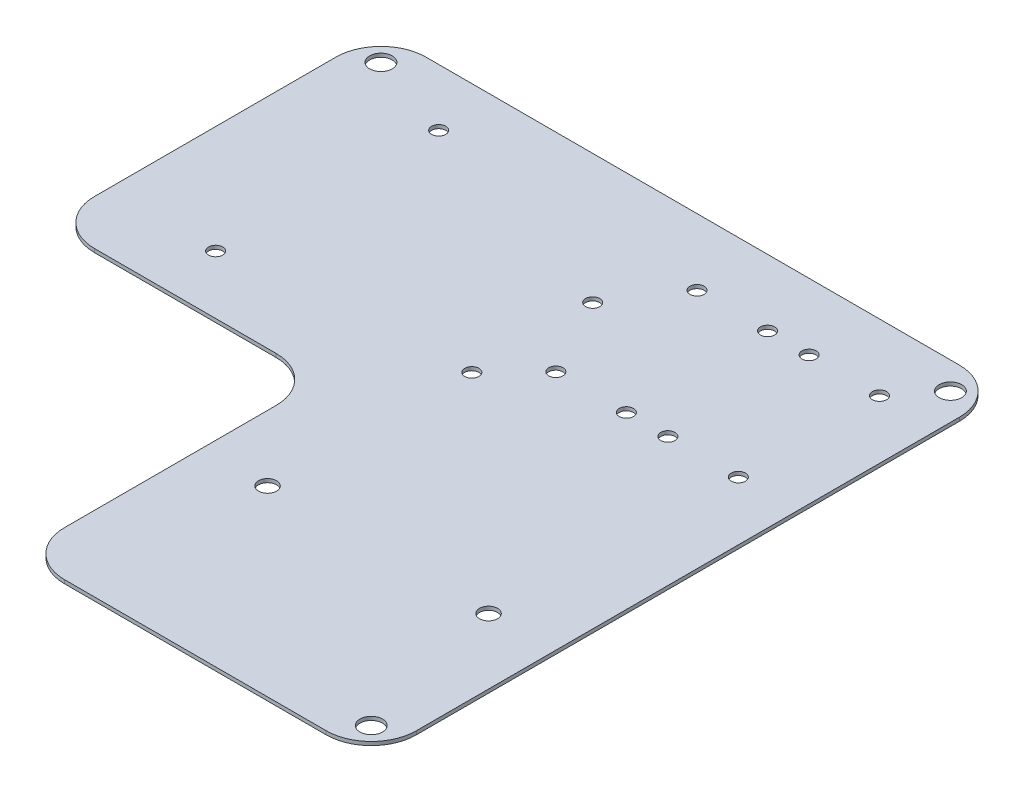
ISO-10303-21;
HEADER;
FILE_DESCRIPTION(('STEP AP214'),'2;1');
FILE_NAME('part.step','',(''),(''),'','','');
FILE_SCHEMA(('AUTOMOTIVE_DESIGN { 1 0 10303 214 1 1 1 1 }'));
ENDSEC;
DATA;
#1=APPLICATION_CONTEXT('core data for automotive mechanical design processes');
#2=APPLICATION_PROTOCOL_DEFINITION('international standard','automotive_design',2000,#1);
#3=PRODUCT_CONTEXT('',#1,'mechanical');
#4=PRODUCT('Part','Part','',(#3));
#5=PRODUCT_RELATED_PRODUCT_CATEGORY('part','',(#4));
#6=PRODUCT_DEFINITION_FORMATION('','',#4);
#7=PRODUCT_DEFINITION_CONTEXT('part definition',#1,'design');
#8=PRODUCT_DEFINITION('design','',#6,#7);
#9=PRODUCT_DEFINITION_SHAPE('','',#8);
#10=(LENGTH_UNIT() NAMED_UNIT(*) SI_UNIT(.MILLI.,.METRE.));
#11=(NAMED_UNIT(*) PLANE_ANGLE_UNIT() SI_UNIT($,.RADIAN.));
#12=(NAMED_UNIT(*) SI_UNIT($,.STERADIAN.) SOLID_ANGLE_UNIT());
#13=UNCERTAINTY_MEASURE_WITH_UNIT(LENGTH_MEASURE(1.E-05),#10,'distance_accuracy_value','');
#14=(GEOMETRIC_REPRESENTATION_CONTEXT(3) GLOBAL_UNCERTAINTY_ASSIGNED_CONTEXT((#13)) GLOBAL_UNIT_ASSIGNED_CONTEXT((#10,
#11,#12)) REPRESENTATION_CONTEXT('',''));
#15=CARTESIAN_POINT('',(0.,0.,0.));
#16=DIRECTION('',(0.,0.,1.));
#17=DIRECTION('',(1.,0.,0.));
#18=AXIS2_PLACEMENT_3D('',#15,#16,#17);
#19=CARTESIAN_POINT('',(66.7401359430946,0.8,39.9912641650939));
#20=DIRECTION('',(0.,1.,0.));
#21=DIRECTION('',(0.,0.,1.));
#22=AXIS2_PLACEMENT_3D('',#19,#20,#21);
#23=PLANE('',#22);
#24=CARTESIAN_POINT('',(70.7401359430946,0.8,-84.4057166015522));
#25=DIRECTION('',(0.,1.,0.));
#26=DIRECTION('',(0.,0.,1.));
#27=AXIS2_PLACEMENT_3D('',#24,#25,#26);
#28=CIRCLE('',#27,2.50000000000001);
#29=CARTESIAN_POINT('',(70.7401359430946,0.8,-81.9057166015522));
#30=VERTEX_POINT('',#29);
#31=EDGE_CURVE('E337',#30,#30,#28,.T.);
#32=ORIENTED_EDGE('',*,*,#31,.F.);
#33=EDGE_LOOP('',(#32));
#34=FACE_BOUND('',#33,.T.);
#35=CARTESIAN_POINT('',(62.2392025744476,0.8,9.49126416509388));
#36=DIRECTION('',(0.,1.,0.));
#37=DIRECTION('',(0.,0.,1.));
#38=AXIS2_PLACEMENT_3D('',#35,#36,#37);
#39=CIRCLE('',#38,2.);
#40=CARTESIAN_POINT('',(62.2392025744476,0.8,11.4912641650939));
#41=VERTEX_POINT('',#40);
#42=EDGE_CURVE('E325',#41,#41,#39,.T.);
#43=ORIENTED_EDGE('',*,*,#42,.F.);
#44=EDGE_LOOP('',(#43));
#45=FACE_BOUND('',#44,.T.);
#46=CARTESIAN_POINT('',(63.7401359430946,0.8,-44.3857166015522));
#47=DIRECTION('',(0.,1.,0.));
#48=DIRECTION('',(0.,0.,1.));
#49=AXIS2_PLACEMENT_3D('',#46,#47,#48);
#50=CIRCLE('',#49,1.57);
#51=CARTESIAN_POINT('',(63.7401359430946,0.8,-42.8157166015522));
#52=VERTEX_POINT('',#51);
#53=EDGE_CURVE('E313',#52,#52,#50,.T.);
#54=ORIENTED_EDGE('',*,*,#53,.F.);
#55=EDGE_LOOP('',(#54));
#56=FACE_BOUND('',#55,.T.);
#57=CARTESIAN_POINT('',(23.2901359430946,0.8,-44.3857166015522));
#58=DIRECTION('',(0.,1.,0.));
#59=DIRECTION('',(0.,0.,1.));
#60=AXIS2_PLACEMENT_3D('',#57,#58,#59);
#61=CIRCLE('',#60,1.57);
#62=CARTESIAN_POINT('',(23.2901359430946,0.8,-42.8157166015522));
#63=VERTEX_POINT('',#62);
#64=EDGE_CURVE('E301',#63,#63,#61,.T.);
#65=ORIENTED_EDGE('',*,*,#64,.F.);
#66=EDGE_LOOP('',(#65));
#67=FACE_BOUND('',#66,.T.);
#68=CARTESIAN_POINT('',(14.0816331350558,0.8,-61.7557166015522));
#69=DIRECTION('',(0.,1.,0.));
#70=DIRECTION('',(0.,0.,1.));
#71=AXIS2_PLACEMENT_3D('',#68,#69,#70);
#72=CIRCLE('',#71,1.57);
#73=CARTESIAN_POINT('',(14.0816331350558,0.8,-60.1857166015522));
#74=VERTEX_POINT('',#73);
#75=EDGE_CURVE('E289',#74,#74,#72,.T.);
#76=ORIENTED_EDGE('',*,*,#75,.F.);
#77=EDGE_LOOP('',(#76));
#78=FACE_BOUND('',#77,.T.);
#79=CARTESIAN_POINT('',(-37.6183668649442,0.8,-29.8557166015522));
#80=DIRECTION('',(0.,1.,0.));
#81=DIRECTION('',(0.,0.,1.));
#82=AXIS2_PLACEMENT_3D('',#79,#80,#81);
#83=CIRCLE('',#82,1.57000000000003);
#84=CARTESIAN_POINT('',(-37.6183668649442,0.8,-28.2857166015522));
#85=VERTEX_POINT('',#84);
#86=EDGE_CURVE('E277',#85,#85,#83,.T.);
#87=ORIENTED_EDGE('',*,*,#86,.F.);
#88=EDGE_LOOP('',(#87));
#89=FACE_BOUND('',#88,.T.);
#90=CARTESIAN_POINT('',(38.9101359430946,0.8,-75.6857166015523));
#91=DIRECTION('',(0.,1.,0.));
#92=DIRECTION('',(0.,0.,1.));
#93=AXIS2_PLACEMENT_3D('',#90,#91,#92);
#94=CIRCLE('',#93,1.56999999999998);
#95=CARTESIAN_POINT('',(38.9101359430946,0.8,-74.1157166015523));
#96=VERTEX_POINT('',#95);
#97=EDGE_CURVE('E265',#96,#96,#94,.T.);
#98=ORIENTED_EDGE('',*,*,#97,.F.);
#99=EDGE_LOOP('',(#98));
#100=FACE_BOUND('',#99,.T.);
#101=CARTESIAN_POINT('',(-36.0683668649442,0.8,-77.7557166015522));
#102=DIRECTION('',(0.,1.,0.));
#103=DIRECTION('',(0.,0.,1.));
#104=AXIS2_PLACEMENT_3D('',#101,#102,#103);
#105=CIRCLE('',#104,1.57);
#106=CARTESIAN_POINT('',(-36.0683668649442,0.8,-76.1857166015522));
#107=VERTEX_POINT('',#106);
#108=EDGE_CURVE('E253',#107,#107,#105,.T.);
#109=ORIENTED_EDGE('',*,*,#108,.F.);
#110=EDGE_LOOP('',(#109));
#111=FACE_BOUND('',#110,.T.);
#112=CARTESIAN_POINT('',(66.7401359430946,0.8,39.9912641650939));
#113=DIRECTION('',(0.,1.,0.));
#114=DIRECTION('',(0.,0.,1.));
#115=AXIS2_PLACEMENT_3D('',#112,#113,#114);
#116=CIRCLE('',#115,10.);
#117=CARTESIAN_POINT('',(66.7401359430945,0.8,49.9912641650939));
#118=VERTEX_POINT('',#117);
#119=CARTESIAN_POINT('',(76.7401359430946,0.8,39.9912641650938));
#120=VERTEX_POINT('',#119);
#121=EDGE_CURVE('E180',#118,#120,#116,.T.);
#122=ORIENTED_EDGE('',*,*,#121,.T.);
#123=DIRECTION('',(0.,0.,-1.));
#124=VECTOR('',#123,1.);
#125=CARTESIAN_POINT('',(76.7401359430946,0.8,39.9912641650938));
#126=LINE('',#125,#124);
#127=CARTESIAN_POINT('',(76.7401359430946,0.8,-80.4057166015521));
#128=VERTEX_POINT('',#127);
#129=EDGE_CURVE('E104',#120,#128,#126,.T.);
#130=ORIENTED_EDGE('',*,*,#129,.T.);
#131=CARTESIAN_POINT('',(66.7401359430946,0.8,-80.4057166015522));
#132=DIRECTION('',(0.,1.,0.));
#133=DIRECTION('',(0.,0.,-1.));
#134=AXIS2_PLACEMENT_3D('',#131,#132,#133);
#135=CIRCLE('',#134,9.99999999999999);
#136=CARTESIAN_POINT('',(66.7401359430945,0.8,-90.4057166015522));
#137=VERTEX_POINT('',#136);
#138=EDGE_CURVE('E207',#128,#137,#135,.T.);
#139=ORIENTED_EDGE('',*,*,#138,.T.);
#140=DIRECTION('',(-1.,0.,0.));
#141=VECTOR('',#140,1.);
#142=CARTESIAN_POINT('',(-51.5183668649441,0.8,-90.4057166015522));
#143=LINE('',#142,#141);
#144=CARTESIAN_POINT('',(-51.5183668649442,0.8,-90.4057166015522));
#145=VERTEX_POINT('',#144);
#146=EDGE_CURVE('E224',#137,#145,#143,.T.);
#147=ORIENTED_EDGE('',*,*,#146,.T.);
#148=CARTESIAN_POINT('',(-51.5183668649442,0.8,-80.4057166015522));
#149=DIRECTION('',(0.,1.,0.));
#150=DIRECTION('',(0.,0.,-1.));
#151=AXIS2_PLACEMENT_3D('',#148,#149,#150);
#152=CIRCLE('',#151,10.);
#153=CARTESIAN_POINT('',(-61.5183668649442,0.8,-80.4057166015521));
#154=VERTEX_POINT('',#153);
#155=EDGE_CURVE('E221',#145,#154,#152,.T.);
#156=ORIENTED_EDGE('',*,*,#155,.T.);
#157=DIRECTION('',(0.,0.,1.));
#158=VECTOR('',#157,1.);
#159=CARTESIAN_POINT('',(-61.5183668649442,0.8,-80.4057166015521));
#160=LINE('',#159,#158);
#161=CARTESIAN_POINT('',(-61.5183668649442,0.8,-26.9057166015523));
#162=VERTEX_POINT('',#161);
#163=EDGE_CURVE('E223',#154,#162,#160,.T.);
#164=ORIENTED_EDGE('',*,*,#163,.T.);
#165=CARTESIAN_POINT('',(-51.5183668649442,0.8,-26.9057166015522));
#166=DIRECTION('',(0.,1.,0.));
#167=DIRECTION('',(0.,0.,-1.));
#168=AXIS2_PLACEMENT_3D('',#165,#166,#167);
#169=CIRCLE('',#168,10.);
#170=CARTESIAN_POINT('',(-51.5183668649441,0.8,-16.9057166015522));
#171=VERTEX_POINT('',#170);
#172=EDGE_CURVE('E226',#162,#171,#169,.T.);
#173=ORIENTED_EDGE('',*,*,#172,.T.);
#174=DIRECTION('',(1.,0.,0.));
#175=VECTOR('',#174,1.);
#176=CARTESIAN_POINT('',(-11.2607974255525,0.8,-16.9057166015522));
#177=LINE('',#176,#175);
#178=CARTESIAN_POINT('',(-11.2607974255524,0.8,-16.9057166015522));
#179=VERTEX_POINT('',#178);
#180=EDGE_CURVE('E232',#171,#179,#177,.T.);
#181=ORIENTED_EDGE('',*,*,#180,.T.);
#182=CARTESIAN_POINT('',(-11.2607974255524,0.8,-6.90571660155219));
#183=DIRECTION('',(0.,-1.,0.));
#184=DIRECTION('',(0.,0.,1.));
#185=AXIS2_PLACEMENT_3D('',#182,#183,#184);
#186=CIRCLE('',#185,10.);
#187=CARTESIAN_POINT('',(-1.26079742555238,0.8,-6.90571660155211));
#188=VERTEX_POINT('',#187);
#189=EDGE_CURVE('E136',#179,#188,#186,.T.);
#190=ORIENTED_EDGE('',*,*,#189,.T.);
#191=DIRECTION('',(0.,0.,1.));
#192=VECTOR('',#191,1.);
#193=CARTESIAN_POINT('',(-1.26079742555239,0.8,39.9912641650938));
#194=LINE('',#193,#192);
#195=CARTESIAN_POINT('',(-1.26079742555239,0.8,39.9912641650938));
#196=VERTEX_POINT('',#195);
#197=EDGE_CURVE('E129',#188,#196,#194,.T.);
#198=ORIENTED_EDGE('',*,*,#197,.T.);
#199=CARTESIAN_POINT('',(8.73920257444761,0.8,39.9912641650939));
#200=DIRECTION('',(0.,1.,0.));
#201=DIRECTION('',(0.,0.,-1.));
#202=AXIS2_PLACEMENT_3D('',#199,#200,#201);
#203=CIRCLE('',#202,10.);
#204=CARTESIAN_POINT('',(8.73920257444768,0.8,49.9912641650939));
#205=VERTEX_POINT('',#204);
#206=EDGE_CURVE('E133',#196,#205,#203,.T.);
#207=ORIENTED_EDGE('',*,*,#206,.T.);
#208=DIRECTION('',(1.,0.,0.));
#209=VECTOR('',#208,1.);
#210=CARTESIAN_POINT('',(8.73920257444768,0.8,49.9912641650939));
#211=LINE('',#210,#209);
#212=EDGE_CURVE('E51',#205,#118,#211,.T.);
#213=ORIENTED_EDGE('',*,*,#212,.T.);
#214=EDGE_LOOP('',(#122,#130,#139,#147,#156,#164,#173,#181,#190,#198,#207,#213));
#215=FACE_BOUND('',#214,.T.);
#216=CARTESIAN_POINT('',(48.1201359430946,0.8,-75.6857166015522));
#217=DIRECTION('',(0.,1.,0.));
#218=DIRECTION('',(0.,0.,1.));
#219=AXIS2_PLACEMENT_3D('',#216,#217,#218);
#220=CIRCLE('',#219,1.57);
#221=CARTESIAN_POINT('',(48.1201359430946,0.8,-74.1157166015522));
#222=VERTEX_POINT('',#221);
#223=EDGE_CURVE('E160',#222,#222,#220,.T.);
#224=ORIENTED_EDGE('',*,*,#223,.F.);
#225=EDGE_LOOP('',(#224));
#226=FACE_BOUND('',#225,.T.);
#227=CARTESIAN_POINT('',(23.2901359430946,0.8,-75.6857166015522));
#228=DIRECTION('',(0.,1.,0.));
#229=DIRECTION('',(0.,0.,1.));
#230=AXIS2_PLACEMENT_3D('',#227,#228,#229);
#231=CIRCLE('',#230,1.57);
#232=CARTESIAN_POINT('',(23.2901359430946,0.8,-74.1157166015522));
#233=VERTEX_POINT('',#232);
#234=EDGE_CURVE('E259',#233,#233,#231,.T.);
#235=ORIENTED_EDGE('',*,*,#234,.F.);
#236=EDGE_LOOP('',(#235));
#237=FACE_BOUND('',#236,.T.);
#238=CARTESIAN_POINT('',(63.7401359430946,0.8,-75.6857166015522));
#239=DIRECTION('',(0.,1.,0.));
#240=DIRECTION('',(0.,0.,1.));
#241=AXIS2_PLACEMENT_3D('',#238,#239,#240);
#242=CIRCLE('',#241,1.57);
#243=CARTESIAN_POINT('',(63.7401359430946,0.8,-74.1157166015522));
#244=VERTEX_POINT('',#243);
#245=EDGE_CURVE('E271',#244,#244,#242,.T.);
#246=ORIENTED_EDGE('',*,*,#245,.F.);
#247=EDGE_LOOP('',(#246));
#248=FACE_BOUND('',#247,.T.);
#249=CARTESIAN_POINT('',(14.0816331350558,0.8,-34.9557166015522));
#250=DIRECTION('',(0.,1.,0.));
#251=DIRECTION('',(0.,0.,1.));
#252=AXIS2_PLACEMENT_3D('',#249,#250,#251);
#253=CIRCLE('',#252,1.57);
#254=CARTESIAN_POINT('',(14.0816331350558,0.8,-33.3857166015522));
#255=VERTEX_POINT('',#254);
#256=EDGE_CURVE('E283',#255,#255,#253,.T.);
#257=ORIENTED_EDGE('',*,*,#256,.F.);
#258=EDGE_LOOP('',(#257));
#259=FACE_BOUND('',#258,.T.);
#260=CARTESIAN_POINT('',(38.9101359430946,0.8,-44.3857166015522));
#261=DIRECTION('',(0.,1.,0.));
#262=DIRECTION('',(0.,0.,1.));
#263=AXIS2_PLACEMENT_3D('',#260,#261,#262);
#264=CIRCLE('',#263,1.57);
#265=CARTESIAN_POINT('',(38.9101359430946,0.8,-42.8157166015522));
#266=VERTEX_POINT('',#265);
#267=EDGE_CURVE('E295',#266,#266,#264,.T.);
#268=ORIENTED_EDGE('',*,*,#267,.F.);
#269=EDGE_LOOP('',(#268));
#270=FACE_BOUND('',#269,.T.);
#271=CARTESIAN_POINT('',(48.1201359430946,0.8,-44.3857166015522));
#272=DIRECTION('',(0.,1.,0.));
#273=DIRECTION('',(0.,0.,1.));
#274=AXIS2_PLACEMENT_3D('',#271,#272,#273);
#275=CIRCLE('',#274,1.57);
#276=CARTESIAN_POINT('',(48.1201359430946,0.8,-42.8157166015522));
#277=VERTEX_POINT('',#276);
#278=EDGE_CURVE('E307',#277,#277,#275,.T.);
#279=ORIENTED_EDGE('',*,*,#278,.F.);
#280=EDGE_LOOP('',(#279));
#281=FACE_BOUND('',#280,.T.);
#282=CARTESIAN_POINT('',(13.2392025744476,0.8,9.49126416509388));
#283=DIRECTION('',(0.,1.,0.));
#284=DIRECTION('',(0.,0.,1.));
#285=AXIS2_PLACEMENT_3D('',#282,#283,#284);
#286=CIRCLE('',#285,2.);
#287=CARTESIAN_POINT('',(13.2392025744476,0.8,11.4912641650939));
#288=VERTEX_POINT('',#287);
#289=EDGE_CURVE('E319',#288,#288,#286,.T.);
#290=ORIENTED_EDGE('',*,*,#289,.F.);
#291=EDGE_LOOP('',(#290));
#292=FACE_BOUND('',#291,.T.);
#293=CARTESIAN_POINT('',(-55.5183668649442,0.8,-84.4057166015522));
#294=DIRECTION('',(0.,1.,0.));
#295=DIRECTION('',(0.,0.,1.));
#296=AXIS2_PLACEMENT_3D('',#293,#294,#295);
#297=CIRCLE('',#296,2.5);
#298=CARTESIAN_POINT('',(-55.5183668649442,0.8,-81.9057166015522));
#299=VERTEX_POINT('',#298);
#300=EDGE_CURVE('E331',#299,#299,#297,.T.);
#301=ORIENTED_EDGE('',*,*,#300,.F.);
#302=EDGE_LOOP('',(#301));
#303=FACE_BOUND('',#302,.T.);
#304=CARTESIAN_POINT('',(70.7401359430946,0.8,43.9912641650939));
#305=DIRECTION('',(0.,1.,0.));
#306=DIRECTION('',(0.,0.,1.));
#307=AXIS2_PLACEMENT_3D('',#304,#305,#306);
#308=CIRCLE('',#307,2.50000000000001);
#309=CARTESIAN_POINT('',(70.7401359430946,0.8,46.4912641650939));
#310=VERTEX_POINT('',#309);
#311=EDGE_CURVE('E343',#310,#310,#308,.T.);
#312=ORIENTED_EDGE('',*,*,#311,.F.);
#313=EDGE_LOOP('',(#312));
#314=FACE_BOUND('',#313,.T.);
#315=ADVANCED_FACE('F34',(#34,#45,#56,#67,#78,#89,#100,#111,#215,#226,#237,#248,#259,#270,#281,
#292,#303,#314),#23,.T.);
#316=CARTESIAN_POINT('',(66.7401359430946,0.,39.9912641650939));
#317=DIRECTION('',(0.,1.,0.));
#318=DIRECTION('',(0.,0.,1.));
#319=AXIS2_PLACEMENT_3D('',#316,#317,#318);
#320=PLANE('',#319);
#321=CARTESIAN_POINT('',(66.7401359430946,0.,39.9912641650939));
#322=DIRECTION('',(0.,1.,0.));
#323=DIRECTION('',(0.,0.,1.));
#324=AXIS2_PLACEMENT_3D('',#321,#322,#323);
#325=CIRCLE('',#324,10.);
#326=CARTESIAN_POINT('',(66.7401359430945,0.,49.9912641650939));
#327=VERTEX_POINT('',#326);
#328=CARTESIAN_POINT('',(76.7401359430946,0.,39.9912641650938));
#329=VERTEX_POINT('',#328);
#330=EDGE_CURVE('E156',#327,#329,#325,.T.);
#331=ORIENTED_EDGE('',*,*,#330,.F.);
#332=DIRECTION('',(1.,0.,0.));
#333=VECTOR('',#332,1.);
#334=CARTESIAN_POINT('',(35.1201359430945,0.,49.9912641650939));
#335=LINE('',#334,#333);
#336=CARTESIAN_POINT('',(8.73920257444768,0.,49.9912641650939));
#337=VERTEX_POINT('',#336);
#338=EDGE_CURVE('E92',#337,#327,#335,.T.);
#339=ORIENTED_EDGE('',*,*,#338,.F.);
#340=CARTESIAN_POINT('',(8.73920257444761,0.,39.9912641650939));
#341=DIRECTION('',(0.,1.,0.));
#342=DIRECTION('',(0.,0.,-1.));
#343=AXIS2_PLACEMENT_3D('',#340,#341,#342);
#344=CIRCLE('',#343,10.);
#345=CARTESIAN_POINT('',(-1.26079742555239,0.,39.9912641650938));
#346=VERTEX_POINT('',#345);
#347=EDGE_CURVE('E177',#346,#337,#344,.T.);
#348=ORIENTED_EDGE('',*,*,#347,.F.);
#349=DIRECTION('',(0.,0.,1.));
#350=VECTOR('',#349,1.);
#351=CARTESIAN_POINT('',(-1.26079742555239,0.,39.9912641650938));
#352=LINE('',#351,#350);
#353=CARTESIAN_POINT('',(-1.26079742555238,0.,-6.90571660155211));
#354=VERTEX_POINT('',#353);
#355=EDGE_CURVE('E145',#354,#346,#352,.T.);
#356=ORIENTED_EDGE('',*,*,#355,.F.);
#357=CARTESIAN_POINT('',(-11.2607974255524,0.,-6.90571660155219));
#358=DIRECTION('',(0.,-1.,0.));
#359=DIRECTION('',(0.,0.,1.));
#360=AXIS2_PLACEMENT_3D('',#357,#358,#359);
#361=CIRCLE('',#360,10.);
#362=CARTESIAN_POINT('',(-11.2607974255524,0.,-16.9057166015522));
#363=VERTEX_POINT('',#362);
#364=EDGE_CURVE('E174',#363,#354,#361,.T.);
#365=ORIENTED_EDGE('',*,*,#364,.F.);
#366=DIRECTION('',(1.,0.,0.));
#367=VECTOR('',#366,1.);
#368=CARTESIAN_POINT('',(-11.2607974255525,0.,-16.9057166015522));
#369=LINE('',#368,#367);
#370=CARTESIAN_POINT('',(-51.5183668649441,0.,-16.9057166015522));
#371=VERTEX_POINT('',#370);
#372=EDGE_CURVE('E172',#371,#363,#369,.T.);
#373=ORIENTED_EDGE('',*,*,#372,.F.);
#374=CARTESIAN_POINT('',(-51.5183668649442,0.,-26.9057166015522));
#375=DIRECTION('',(0.,1.,0.));
#376=DIRECTION('',(0.,0.,-1.));
#377=AXIS2_PLACEMENT_3D('',#374,#375,#376);
#378=CIRCLE('',#377,10.);
#379=CARTESIAN_POINT('',(-61.5183668649442,0.,-26.9057166015523));
#380=VERTEX_POINT('',#379);
#381=EDGE_CURVE('E170',#380,#371,#378,.T.);
#382=ORIENTED_EDGE('',*,*,#381,.F.);
#383=DIRECTION('',(0.,0.,1.));
#384=VECTOR('',#383,1.);
#385=CARTESIAN_POINT('',(-61.5183668649442,0.,-80.4057166015521));
#386=LINE('',#385,#384);
#387=CARTESIAN_POINT('',(-61.5183668649442,0.,-80.4057166015521));
#388=VERTEX_POINT('',#387);
#389=EDGE_CURVE('E168',#388,#380,#386,.T.);
#390=ORIENTED_EDGE('',*,*,#389,.F.);
#391=CARTESIAN_POINT('',(-51.5183668649442,0.,-80.4057166015522));
#392=DIRECTION('',(0.,1.,0.));
#393=DIRECTION('',(0.,0.,-1.));
#394=AXIS2_PLACEMENT_3D('',#391,#392,#393);
#395=CIRCLE('',#394,10.);
#396=CARTESIAN_POINT('',(-51.5183668649442,0.,-90.4057166015522));
#397=VERTEX_POINT('',#396);
#398=EDGE_CURVE('E166',#397,#388,#395,.T.);
#399=ORIENTED_EDGE('',*,*,#398,.F.);
#400=DIRECTION('',(-1.,0.,0.));
#401=VECTOR('',#400,1.);
#402=CARTESIAN_POINT('',(-51.5183668649441,0.,-90.4057166015522));
#403=LINE('',#402,#401);
#404=CARTESIAN_POINT('',(66.7401359430945,0.,-90.4057166015522));
#405=VERTEX_POINT('',#404);
#406=EDGE_CURVE('E164',#405,#397,#403,.T.);
#407=ORIENTED_EDGE('',*,*,#406,.F.);
#408=CARTESIAN_POINT('',(66.7401359430946,0.,-80.4057166015522));
#409=DIRECTION('',(0.,1.,0.));
#410=DIRECTION('',(0.,0.,-1.));
#411=AXIS2_PLACEMENT_3D('',#408,#409,#410);
#412=CIRCLE('',#411,9.99999999999999);
#413=CARTESIAN_POINT('',(76.7401359430946,0.,-80.4057166015521));
#414=VERTEX_POINT('',#413);
#415=EDGE_CURVE('E162',#414,#405,#412,.T.);
#416=ORIENTED_EDGE('',*,*,#415,.F.);
#417=DIRECTION('',(0.,0.,-1.));
#418=VECTOR('',#417,1.);
#419=CARTESIAN_POINT('',(76.7401359430946,0.,-80.4057166015521));
#420=LINE('',#419,#418);
#421=EDGE_CURVE('E159',#329,#414,#420,.T.);
#422=ORIENTED_EDGE('',*,*,#421,.F.);
#423=EDGE_LOOP('',(#331,#339,#348,#356,#365,#373,#382,#390,#399,#407,#416,#422));
#424=FACE_BOUND('',#423,.T.);
#425=CARTESIAN_POINT('',(48.1201359430946,0.,-75.6857166015522));
#426=DIRECTION('',(0.,1.,0.));
#427=DIRECTION('',(0.,0.,1.));
#428=AXIS2_PLACEMENT_3D('',#425,#426,#427);
#429=CIRCLE('',#428,1.57);
#430=CARTESIAN_POINT('',(48.1201359430946,0.,-74.1157166015522));
#431=VERTEX_POINT('',#430);
#432=EDGE_CURVE('E250',#431,#431,#429,.T.);
#433=ORIENTED_EDGE('',*,*,#432,.T.);
#434=EDGE_LOOP('',(#433));
#435=FACE_BOUND('',#434,.T.);
#436=CARTESIAN_POINT('',(-36.0683668649442,0.,-77.7557166015522));
#437=DIRECTION('',(0.,1.,0.));
#438=DIRECTION('',(0.,0.,1.));
#439=AXIS2_PLACEMENT_3D('',#436,#437,#438);
#440=CIRCLE('',#439,1.57);
#441=CARTESIAN_POINT('',(-36.0683668649442,0.,-76.1857166015522));
#442=VERTEX_POINT('',#441);
#443=EDGE_CURVE('E256',#442,#442,#440,.T.);
#444=ORIENTED_EDGE('',*,*,#443,.T.);
#445=EDGE_LOOP('',(#444));
#446=FACE_BOUND('',#445,.T.);
#447=CARTESIAN_POINT('',(23.2901359430946,0.,-75.6857166015522));
#448=DIRECTION('',(0.,1.,0.));
#449=DIRECTION('',(0.,0.,1.));
#450=AXIS2_PLACEMENT_3D('',#447,#448,#449);
#451=CIRCLE('',#450,1.57);
#452=CARTESIAN_POINT('',(23.2901359430946,0.,-74.1157166015522));
#453=VERTEX_POINT('',#452);
#454=EDGE_CURVE('E262',#453,#453,#451,.T.);
#455=ORIENTED_EDGE('',*,*,#454,.T.);
#456=EDGE_LOOP('',(#455));
#457=FACE_BOUND('',#456,.T.);
#458=CARTESIAN_POINT('',(38.9101359430946,0.,-75.6857166015523));
#459=DIRECTION('',(0.,1.,0.));
#460=DIRECTION('',(0.,0.,1.));
#461=AXIS2_PLACEMENT_3D('',#458,#459,#460);
#462=CIRCLE('',#461,1.56999999999998);
#463=CARTESIAN_POINT('',(38.9101359430946,0.,-74.1157166015523));
#464=VERTEX_POINT('',#463);
#465=EDGE_CURVE('E268',#464,#464,#462,.T.);
#466=ORIENTED_EDGE('',*,*,#465,.T.);
#467=EDGE_LOOP('',(#466));
#468=FACE_BOUND('',#467,.T.);
#469=CARTESIAN_POINT('',(63.7401359430946,0.,-75.6857166015522));
#470=DIRECTION('',(0.,1.,0.));
#471=DIRECTION('',(0.,0.,1.));
#472=AXIS2_PLACEMENT_3D('',#469,#470,#471);
#473=CIRCLE('',#472,1.57);
#474=CARTESIAN_POINT('',(63.7401359430946,0.,-74.1157166015522));
#475=VERTEX_POINT('',#474);
#476=EDGE_CURVE('E274',#475,#475,#473,.T.);
#477=ORIENTED_EDGE('',*,*,#476,.T.);
#478=EDGE_LOOP('',(#477));
#479=FACE_BOUND('',#478,.T.);
#480=CARTESIAN_POINT('',(-37.6183668649442,0.,-29.8557166015522));
#481=DIRECTION('',(0.,1.,0.));
#482=DIRECTION('',(0.,0.,1.));
#483=AXIS2_PLACEMENT_3D('',#480,#481,#482);
#484=CIRCLE('',#483,1.57000000000003);
#485=CARTESIAN_POINT('',(-37.6183668649442,0.,-28.2857166015522));
#486=VERTEX_POINT('',#485);
#487=EDGE_CURVE('E280',#486,#486,#484,.T.);
#488=ORIENTED_EDGE('',*,*,#487,.T.);
#489=EDGE_LOOP('',(#488));
#490=FACE_BOUND('',#489,.T.);
#491=CARTESIAN_POINT('',(14.0816331350558,0.,-34.9557166015522));
#492=DIRECTION('',(0.,1.,0.));
#493=DIRECTION('',(0.,0.,1.));
#494=AXIS2_PLACEMENT_3D('',#491,#492,#493);
#495=CIRCLE('',#494,1.57);
#496=CARTESIAN_POINT('',(14.0816331350558,0.,-33.3857166015522));
#497=VERTEX_POINT('',#496);
#498=EDGE_CURVE('E286',#497,#497,#495,.T.);
#499=ORIENTED_EDGE('',*,*,#498,.T.);
#500=EDGE_LOOP('',(#499));
#501=FACE_BOUND('',#500,.T.);
#502=CARTESIAN_POINT('',(14.0816331350558,0.,-61.7557166015522));
#503=DIRECTION('',(0.,1.,0.));
#504=DIRECTION('',(0.,0.,1.));
#505=AXIS2_PLACEMENT_3D('',#502,#503,#504);
#506=CIRCLE('',#505,1.57);
#507=CARTESIAN_POINT('',(14.0816331350558,0.,-60.1857166015522));
#508=VERTEX_POINT('',#507);
#509=EDGE_CURVE('E292',#508,#508,#506,.T.);
#510=ORIENTED_EDGE('',*,*,#509,.T.);
#511=EDGE_LOOP('',(#510));
#512=FACE_BOUND('',#511,.T.);
#513=CARTESIAN_POINT('',(38.9101359430946,0.,-44.3857166015522));
#514=DIRECTION('',(0.,1.,0.));
#515=DIRECTION('',(0.,0.,1.));
#516=AXIS2_PLACEMENT_3D('',#513,#514,#515);
#517=CIRCLE('',#516,1.57);
#518=CARTESIAN_POINT('',(38.9101359430946,0.,-42.8157166015522));
#519=VERTEX_POINT('',#518);
#520=EDGE_CURVE('E298',#519,#519,#517,.T.);
#521=ORIENTED_EDGE('',*,*,#520,.T.);
#522=EDGE_LOOP('',(#521));
#523=FACE_BOUND('',#522,.T.);
#524=CARTESIAN_POINT('',(23.2901359430946,0.,-44.3857166015522));
#525=DIRECTION('',(0.,1.,0.));
#526=DIRECTION('',(0.,0.,1.));
#527=AXIS2_PLACEMENT_3D('',#524,#525,#526);
#528=CIRCLE('',#527,1.57);
#529=CARTESIAN_POINT('',(23.2901359430946,0.,-42.8157166015522));
#530=VERTEX_POINT('',#529);
#531=EDGE_CURVE('E304',#530,#530,#528,.T.);
#532=ORIENTED_EDGE('',*,*,#531,.T.);
#533=EDGE_LOOP('',(#532));
#534=FACE_BOUND('',#533,.T.);
#535=CARTESIAN_POINT('',(48.1201359430946,0.,-44.3857166015522));
#536=DIRECTION('',(0.,1.,0.));
#537=DIRECTION('',(0.,0.,1.));
#538=AXIS2_PLACEMENT_3D('',#535,#536,#537);
#539=CIRCLE('',#538,1.57);
#540=CARTESIAN_POINT('',(48.1201359430946,0.,-42.8157166015522));
#541=VERTEX_POINT('',#540);
#542=EDGE_CURVE('E310',#541,#541,#539,.T.);
#543=ORIENTED_EDGE('',*,*,#542,.T.);
#544=EDGE_LOOP('',(#543));
#545=FACE_BOUND('',#544,.T.);
#546=CARTESIAN_POINT('',(63.7401359430946,0.,-44.3857166015522));
#547=DIRECTION('',(0.,1.,0.));
#548=DIRECTION('',(0.,0.,1.));
#549=AXIS2_PLACEMENT_3D('',#546,#547,#548);
#550=CIRCLE('',#549,1.57);
#551=CARTESIAN_POINT('',(63.7401359430946,0.,-42.8157166015522));
#552=VERTEX_POINT('',#551);
#553=EDGE_CURVE('E316',#552,#552,#550,.T.);
#554=ORIENTED_EDGE('',*,*,#553,.T.);
#555=EDGE_LOOP('',(#554));
#556=FACE_BOUND('',#555,.T.);
#557=CARTESIAN_POINT('',(13.2392025744476,0.,9.49126416509388));
#558=DIRECTION('',(0.,1.,0.));
#559=DIRECTION('',(0.,0.,1.));
#560=AXIS2_PLACEMENT_3D('',#557,#558,#559);
#561=CIRCLE('',#560,2.);
#562=CARTESIAN_POINT('',(13.2392025744476,0.,11.4912641650939));
#563=VERTEX_POINT('',#562);
#564=EDGE_CURVE('E322',#563,#563,#561,.T.);
#565=ORIENTED_EDGE('',*,*,#564,.T.);
#566=EDGE_LOOP('',(#565));
#567=FACE_BOUND('',#566,.T.);
#568=CARTESIAN_POINT('',(62.2392025744476,0.,9.49126416509388));
#569=DIRECTION('',(0.,1.,0.));
#570=DIRECTION('',(0.,0.,1.));
#571=AXIS2_PLACEMENT_3D('',#568,#569,#570);
#572=CIRCLE('',#571,2.);
#573=CARTESIAN_POINT('',(62.2392025744476,0.,11.4912641650939));
#574=VERTEX_POINT('',#573);
#575=EDGE_CURVE('E328',#574,#574,#572,.T.);
#576=ORIENTED_EDGE('',*,*,#575,.T.);
#577=EDGE_LOOP('',(#576));
#578=FACE_BOUND('',#577,.T.);
#579=CARTESIAN_POINT('',(-55.5183668649442,0.,-84.4057166015522));
#580=DIRECTION('',(0.,1.,0.));
#581=DIRECTION('',(0.,0.,1.));
#582=AXIS2_PLACEMENT_3D('',#579,#580,#581);
#583=CIRCLE('',#582,2.5);
#584=CARTESIAN_POINT('',(-55.5183668649442,0.,-81.9057166015522));
#585=VERTEX_POINT('',#584);
#586=EDGE_CURVE('E334',#585,#585,#583,.T.);
#587=ORIENTED_EDGE('',*,*,#586,.T.);
#588=EDGE_LOOP('',(#587));
#589=FACE_BOUND('',#588,.T.);
#590=CARTESIAN_POINT('',(70.7401359430946,0.,-84.4057166015522));
#591=DIRECTION('',(0.,1.,0.));
#592=DIRECTION('',(0.,0.,1.));
#593=AXIS2_PLACEMENT_3D('',#590,#591,#592);
#594=CIRCLE('',#593,2.50000000000001);
#595=CARTESIAN_POINT('',(70.7401359430946,0.,-81.9057166015522));
#596=VERTEX_POINT('',#595);
#597=EDGE_CURVE('E340',#596,#596,#594,.T.);
#598=ORIENTED_EDGE('',*,*,#597,.T.);
#599=EDGE_LOOP('',(#598));
#600=FACE_BOUND('',#599,.T.);
#601=CARTESIAN_POINT('',(70.7401359430946,0.,43.9912641650939));
#602=DIRECTION('',(0.,1.,0.));
#603=DIRECTION('',(0.,0.,1.));
#604=AXIS2_PLACEMENT_3D('',#601,#602,#603);
#605=CIRCLE('',#604,2.50000000000001);
#606=CARTESIAN_POINT('',(70.7401359430946,0.,46.4912641650939));
#607=VERTEX_POINT('',#606);
#608=EDGE_CURVE('E346',#607,#607,#605,.T.);
#609=ORIENTED_EDGE('',*,*,#608,.T.);
#610=EDGE_LOOP('',(#609));
#611=FACE_BOUND('',#610,.T.);
#612=ADVANCED_FACE('F209',(#424,#435,#446,#457,#468,#479,#490,#501,#512,#523,#534,#545,#556,
#567,#578,#589,#600,#611),#320,.F.);
#613=CARTESIAN_POINT('',(66.7401359430946,0.8,39.9912641650939));
#614=DIRECTION('',(0.,-1.,0.));
#615=DIRECTION('',(0.,0.,-1.));
#616=AXIS2_PLACEMENT_3D('',#613,#614,#615);
#617=CYLINDRICAL_SURFACE('',#616,10.);
#618=ORIENTED_EDGE('',*,*,#330,.T.);
#619=DIRECTION('',(0.,-1.,0.));
#620=VECTOR('',#619,1.);
#621=CARTESIAN_POINT('',(76.7401359430946,0.8,39.9912641650938));
#622=LINE('',#621,#620);
#623=EDGE_CURVE('E11',#120,#329,#622,.T.);
#624=ORIENTED_EDGE('',*,*,#623,.F.);
#625=ORIENTED_EDGE('',*,*,#121,.F.);
#626=DIRECTION('',(0.,-1.,0.));
#627=VECTOR('',#626,1.);
#628=CARTESIAN_POINT('',(66.7401359430945,0.8,49.9912641650939));
#629=LINE('',#628,#627);
#630=EDGE_CURVE('E152',#118,#327,#629,.T.);
#631=ORIENTED_EDGE('',*,*,#630,.T.);
#632=EDGE_LOOP('',(#618,#624,#625,#631));
#633=FACE_BOUND('',#632,.T.);
#634=ADVANCED_FACE('F36',(#633),#617,.T.);
#635=CARTESIAN_POINT('',(76.7401359430946,0.8,-80.4057166015521));
#636=DIRECTION('',(-1.,0.,0.));
#637=DIRECTION('',(0.,0.,1.));
#638=AXIS2_PLACEMENT_3D('',#635,#636,#637);
#639=PLANE('',#638);
#640=ORIENTED_EDGE('',*,*,#421,.T.);
#641=DIRECTION('',(0.,-1.,0.));
#642=VECTOR('',#641,1.);
#643=CARTESIAN_POINT('',(76.7401359430946,0.8,-80.4057166015521));
#644=LINE('',#643,#642);
#645=EDGE_CURVE('E43',#128,#414,#644,.T.);
#646=ORIENTED_EDGE('',*,*,#645,.F.);
#647=ORIENTED_EDGE('',*,*,#129,.F.);
#648=ORIENTED_EDGE('',*,*,#623,.T.);
#649=EDGE_LOOP('',(#640,#646,#647,#648));
#650=FACE_BOUND('',#649,.T.);
#651=ADVANCED_FACE('F391',(#650),#639,.F.);
#652=CARTESIAN_POINT('',(66.7401359430946,0.8,-80.4057166015522));
#653=DIRECTION('',(0.,-1.,0.));
#654=DIRECTION('',(0.,0.,-1.));
#655=AXIS2_PLACEMENT_3D('',#652,#653,#654);
#656=CYLINDRICAL_SURFACE('',#655,9.99999999999999);
#657=ORIENTED_EDGE('',*,*,#415,.T.);
#658=DIRECTION('',(0.,-1.,0.));
#659=VECTOR('',#658,1.);
#660=CARTESIAN_POINT('',(66.7401359430945,0.8,-90.4057166015522));
#661=LINE('',#660,#659);
#662=EDGE_CURVE('E199',#137,#405,#661,.T.);
#663=ORIENTED_EDGE('',*,*,#662,.F.);
#664=ORIENTED_EDGE('',*,*,#138,.F.);
#665=ORIENTED_EDGE('',*,*,#645,.T.);
#666=EDGE_LOOP('',(#657,#663,#664,#665));
#667=FACE_BOUND('',#666,.T.);
#668=ADVANCED_FACE('F205',(#667),#656,.T.);
#669=CARTESIAN_POINT('',(-51.5183668649441,0.8,-90.4057166015522));
#670=DIRECTION('',(0.,0.,1.));
#671=DIRECTION('',(1.,0.,0.));
#672=AXIS2_PLACEMENT_3D('',#669,#670,#671);
#673=PLANE('',#672);
#674=ORIENTED_EDGE('',*,*,#406,.T.);
#675=DIRECTION('',(0.,-1.,0.));
#676=VECTOR('',#675,1.);
#677=CARTESIAN_POINT('',(-51.5183668649442,0.8,-90.4057166015522));
#678=LINE('',#677,#676);
#679=EDGE_CURVE('E196',#145,#397,#678,.T.);
#680=ORIENTED_EDGE('',*,*,#679,.F.);
#681=ORIENTED_EDGE('',*,*,#146,.F.);
#682=ORIENTED_EDGE('',*,*,#662,.T.);
#683=EDGE_LOOP('',(#674,#680,#681,#682));
#684=FACE_BOUND('',#683,.T.);
#685=ADVANCED_FACE('F215',(#684),#673,.F.);
#686=CARTESIAN_POINT('',(-51.5183668649442,0.8,-80.4057166015522));
#687=DIRECTION('',(0.,-1.,0.));
#688=DIRECTION('',(0.,0.,-1.));
#689=AXIS2_PLACEMENT_3D('',#686,#687,#688);
#690=CYLINDRICAL_SURFACE('',#689,10.);
#691=ORIENTED_EDGE('',*,*,#398,.T.);
#692=DIRECTION('',(0.,-1.,0.));
#693=VECTOR('',#692,1.);
#694=CARTESIAN_POINT('',(-61.5183668649442,0.8,-80.4057166015521));
#695=LINE('',#694,#693);
#696=EDGE_CURVE('E193',#154,#388,#695,.T.);
#697=ORIENTED_EDGE('',*,*,#696,.F.);
#698=ORIENTED_EDGE('',*,*,#155,.F.);
#699=ORIENTED_EDGE('',*,*,#679,.T.);
#700=EDGE_LOOP('',(#691,#697,#698,#699));
#701=FACE_BOUND('',#700,.T.);
#702=ADVANCED_FACE('F219',(#701),#690,.T.);
#703=CARTESIAN_POINT('',(-61.5183668649442,0.8,-80.4057166015521));
#704=DIRECTION('',(1.,0.,0.));
#705=DIRECTION('',(0.,0.,-1.));
#706=AXIS2_PLACEMENT_3D('',#703,#704,#705);
#707=PLANE('',#706);
#708=ORIENTED_EDGE('',*,*,#389,.T.);
#709=DIRECTION('',(0.,-1.,0.));
#710=VECTOR('',#709,1.);
#711=CARTESIAN_POINT('',(-61.5183668649442,0.8,-26.9057166015523));
#712=LINE('',#711,#710);
#713=EDGE_CURVE('E190',#162,#380,#712,.T.);
#714=ORIENTED_EDGE('',*,*,#713,.F.);
#715=ORIENTED_EDGE('',*,*,#163,.F.);
#716=ORIENTED_EDGE('',*,*,#696,.T.);
#717=EDGE_LOOP('',(#708,#714,#715,#716));
#718=FACE_BOUND('',#717,.T.);
#719=ADVANCED_FACE('F381',(#718),#707,.F.);
#720=CARTESIAN_POINT('',(-51.5183668649442,0.8,-26.9057166015522));
#721=DIRECTION('',(0.,-1.,0.));
#722=DIRECTION('',(0.,0.,-1.));
#723=AXIS2_PLACEMENT_3D('',#720,#721,#722);
#724=CYLINDRICAL_SURFACE('',#723,10.);
#725=ORIENTED_EDGE('',*,*,#381,.T.);
#726=DIRECTION('',(0.,-1.,0.));
#727=VECTOR('',#726,1.);
#728=CARTESIAN_POINT('',(-51.5183668649441,0.8,-16.9057166015522));
#729=LINE('',#728,#727);
#730=EDGE_CURVE('E187',#171,#371,#729,.T.);
#731=ORIENTED_EDGE('',*,*,#730,.F.);
#732=ORIENTED_EDGE('',*,*,#172,.F.);
#733=ORIENTED_EDGE('',*,*,#713,.T.);
#734=EDGE_LOOP('',(#725,#731,#732,#733));
#735=FACE_BOUND('',#734,.T.);
#736=ADVANCED_FACE('F378',(#735),#724,.T.);
#737=CARTESIAN_POINT('',(-11.2607974255525,0.8,-16.9057166015522));
#738=DIRECTION('',(0.,0.,-1.));
#739=DIRECTION('',(-1.,0.,0.));
#740=AXIS2_PLACEMENT_3D('',#737,#738,#739);
#741=PLANE('',#740);
#742=ORIENTED_EDGE('',*,*,#372,.T.);
#743=DIRECTION('',(0.,-1.,0.));
#744=VECTOR('',#743,1.);
#745=CARTESIAN_POINT('',(-11.2607974255524,0.8,-16.9057166015522));
#746=LINE('',#745,#744);
#747=EDGE_CURVE('E184',#179,#363,#746,.T.);
#748=ORIENTED_EDGE('',*,*,#747,.F.);
#749=ORIENTED_EDGE('',*,*,#180,.F.);
#750=ORIENTED_EDGE('',*,*,#730,.T.);
#751=EDGE_LOOP('',(#742,#748,#749,#750));
#752=FACE_BOUND('',#751,.T.);
#753=ADVANCED_FACE('F238',(#752),#741,.F.);
#754=CARTESIAN_POINT('',(-11.2607974255524,0.8,-6.90571660155219));
#755=DIRECTION('',(0.,-1.,0.));
#756=DIRECTION('',(0.,0.,-1.));
#757=AXIS2_PLACEMENT_3D('',#754,#755,#756);
#758=CYLINDRICAL_SURFACE('',#757,10.);
#759=ORIENTED_EDGE('',*,*,#364,.T.);
#760=DIRECTION('',(0.,-1.,0.));
#761=VECTOR('',#760,1.);
#762=CARTESIAN_POINT('',(-1.26079742555238,0.8,-6.90571660155211));
#763=LINE('',#762,#761);
#764=EDGE_CURVE('E147',#188,#354,#763,.T.);
#765=ORIENTED_EDGE('',*,*,#764,.F.);
#766=ORIENTED_EDGE('',*,*,#189,.F.);
#767=ORIENTED_EDGE('',*,*,#747,.T.);
#768=EDGE_LOOP('',(#759,#765,#766,#767));
#769=FACE_BOUND('',#768,.T.);
#770=ADVANCED_FACE('F242',(#769),#758,.F.);
#771=CARTESIAN_POINT('',(-1.26079742555239,0.8,39.9912641650938));
#772=DIRECTION('',(1.,0.,0.));
#773=DIRECTION('',(0.,0.,-1.));
#774=AXIS2_PLACEMENT_3D('',#771,#772,#773);
#775=PLANE('',#774);
#776=ORIENTED_EDGE('',*,*,#355,.T.);
#777=DIRECTION('',(0.,-1.,0.));
#778=VECTOR('',#777,1.);
#779=CARTESIAN_POINT('',(-1.26079742555239,0.8,39.9912641650938));
#780=LINE('',#779,#778);
#781=EDGE_CURVE('E142',#196,#346,#780,.T.);
#782=ORIENTED_EDGE('',*,*,#781,.F.);
#783=ORIENTED_EDGE('',*,*,#197,.F.);
#784=ORIENTED_EDGE('',*,*,#764,.T.);
#785=EDGE_LOOP('',(#776,#782,#783,#784));
#786=FACE_BOUND('',#785,.T.);
#787=ADVANCED_FACE('F143',(#786),#775,.F.);
#788=CARTESIAN_POINT('',(8.73920257444761,0.8,39.9912641650939));
#789=DIRECTION('',(0.,-1.,0.));
#790=DIRECTION('',(0.,0.,-1.));
#791=AXIS2_PLACEMENT_3D('',#788,#789,#790);
#792=CYLINDRICAL_SURFACE('',#791,10.);
#793=ORIENTED_EDGE('',*,*,#347,.T.);
#794=DIRECTION('',(0.,-1.,0.));
#795=VECTOR('',#794,1.);
#796=CARTESIAN_POINT('',(8.73920257444768,0.8,49.9912641650939));
#797=LINE('',#796,#795);
#798=EDGE_CURVE('E148',#205,#337,#797,.T.);
#799=ORIENTED_EDGE('',*,*,#798,.F.);
#800=ORIENTED_EDGE('',*,*,#206,.F.);
#801=ORIENTED_EDGE('',*,*,#781,.T.);
#802=EDGE_LOOP('',(#793,#799,#800,#801));
#803=FACE_BOUND('',#802,.T.);
#804=ADVANCED_FACE('F150',(#803),#792,.T.);
#805=CARTESIAN_POINT('',(35.1201359430945,0.8,49.9912641650939));
#806=DIRECTION('',(0.,0.,-1.));
#807=DIRECTION('',(-1.,0.,0.));
#808=AXIS2_PLACEMENT_3D('',#805,#806,#807);
#809=PLANE('',#808);
#810=ORIENTED_EDGE('',*,*,#338,.T.);
#811=ORIENTED_EDGE('',*,*,#630,.F.);
#812=ORIENTED_EDGE('',*,*,#212,.F.);
#813=ORIENTED_EDGE('',*,*,#798,.T.);
#814=EDGE_LOOP('',(#810,#811,#812,#813));
#815=FACE_BOUND('',#814,.T.);
#816=ADVANCED_FACE('F243',(#815),#809,.F.);
#817=CARTESIAN_POINT('',(48.1201359430946,0.8,-75.6857166015522));
#818=DIRECTION('',(0.,-1.,0.));
#819=DIRECTION('',(0.,0.,-1.));
#820=AXIS2_PLACEMENT_3D('',#817,#818,#819);
#821=CYLINDRICAL_SURFACE('',#820,1.57);
#822=ORIENTED_EDGE('',*,*,#223,.T.);
#823=EDGE_LOOP('',(#822));
#824=FACE_BOUND('',#823,.T.);
#825=ORIENTED_EDGE('',*,*,#432,.F.);
#826=EDGE_LOOP('',(#825));
#827=FACE_BOUND('',#826,.T.);
#828=ADVANCED_FACE('F365',(#824,#827),#821,.F.);
#829=CARTESIAN_POINT('',(-36.0683668649442,0.8,-77.7557166015522));
#830=DIRECTION('',(0.,-1.,0.));
#831=DIRECTION('',(0.,0.,-1.));
#832=AXIS2_PLACEMENT_3D('',#829,#830,#831);
#833=CYLINDRICAL_SURFACE('',#832,1.57);
#834=ORIENTED_EDGE('',*,*,#108,.T.);
#835=EDGE_LOOP('',(#834));
#836=FACE_BOUND('',#835,.T.);
#837=ORIENTED_EDGE('',*,*,#443,.F.);
#838=EDGE_LOOP('',(#837));
#839=FACE_BOUND('',#838,.T.);
#840=ADVANCED_FACE('F478',(#836,#839),#833,.F.);
#841=CARTESIAN_POINT('',(23.2901359430946,0.8,-75.6857166015522));
#842=DIRECTION('',(0.,-1.,0.));
#843=DIRECTION('',(0.,0.,-1.));
#844=AXIS2_PLACEMENT_3D('',#841,#842,#843);
#845=CYLINDRICAL_SURFACE('',#844,1.57);
#846=ORIENTED_EDGE('',*,*,#234,.T.);
#847=EDGE_LOOP('',(#846));
#848=FACE_BOUND('',#847,.T.);
#849=ORIENTED_EDGE('',*,*,#454,.F.);
#850=EDGE_LOOP('',(#849));
#851=FACE_BOUND('',#850,.T.);
#852=ADVANCED_FACE('F486',(#848,#851),#845,.F.);
#853=CARTESIAN_POINT('',(38.9101359430946,0.8,-75.6857166015523));
#854=DIRECTION('',(0.,-1.,0.));
#855=DIRECTION('',(0.,0.,-1.));
#856=AXIS2_PLACEMENT_3D('',#853,#854,#855);
#857=CYLINDRICAL_SURFACE('',#856,1.56999999999998);
#858=ORIENTED_EDGE('',*,*,#97,.T.);
#859=EDGE_LOOP('',(#858));
#860=FACE_BOUND('',#859,.T.);
#861=ORIENTED_EDGE('',*,*,#465,.F.);
#862=EDGE_LOOP('',(#861));
#863=FACE_BOUND('',#862,.T.);
#864=ADVANCED_FACE('F494',(#860,#863),#857,.F.);
#865=CARTESIAN_POINT('',(63.7401359430946,0.8,-75.6857166015522));
#866=DIRECTION('',(0.,-1.,0.));
#867=DIRECTION('',(0.,0.,-1.));
#868=AXIS2_PLACEMENT_3D('',#865,#866,#867);
#869=CYLINDRICAL_SURFACE('',#868,1.57);
#870=ORIENTED_EDGE('',*,*,#245,.T.);
#871=EDGE_LOOP('',(#870));
#872=FACE_BOUND('',#871,.T.);
#873=ORIENTED_EDGE('',*,*,#476,.F.);
#874=EDGE_LOOP('',(#873));
#875=FACE_BOUND('',#874,.T.);
#876=ADVANCED_FACE('F503',(#872,#875),#869,.F.);
#877=CARTESIAN_POINT('',(-37.6183668649442,0.8,-29.8557166015522));
#878=DIRECTION('',(0.,-1.,0.));
#879=DIRECTION('',(0.,0.,-1.));
#880=AXIS2_PLACEMENT_3D('',#877,#878,#879);
#881=CYLINDRICAL_SURFACE('',#880,1.57000000000003);
#882=ORIENTED_EDGE('',*,*,#86,.T.);
#883=EDGE_LOOP('',(#882));
#884=FACE_BOUND('',#883,.T.);
#885=ORIENTED_EDGE('',*,*,#487,.F.);
#886=EDGE_LOOP('',(#885));
#887=FACE_BOUND('',#886,.T.);
#888=ADVANCED_FACE('F512',(#884,#887),#881,.F.);
#889=CARTESIAN_POINT('',(14.0816331350558,0.8,-34.9557166015522));
#890=DIRECTION('',(0.,-1.,0.));
#891=DIRECTION('',(0.,0.,-1.));
#892=AXIS2_PLACEMENT_3D('',#889,#890,#891);
#893=CYLINDRICAL_SURFACE('',#892,1.57);
#894=ORIENTED_EDGE('',*,*,#256,.T.);
#895=EDGE_LOOP('',(#894));
#896=FACE_BOUND('',#895,.T.);
#897=ORIENTED_EDGE('',*,*,#498,.F.);
#898=EDGE_LOOP('',(#897));
#899=FACE_BOUND('',#898,.T.);
#900=ADVANCED_FACE('F521',(#896,#899),#893,.F.);
#901=CARTESIAN_POINT('',(14.0816331350558,0.8,-61.7557166015522));
#902=DIRECTION('',(0.,-1.,0.));
#903=DIRECTION('',(0.,0.,-1.));
#904=AXIS2_PLACEMENT_3D('',#901,#902,#903);
#905=CYLINDRICAL_SURFACE('',#904,1.57);
#906=ORIENTED_EDGE('',*,*,#75,.T.);
#907=EDGE_LOOP('',(#906));
#908=FACE_BOUND('',#907,.T.);
#909=ORIENTED_EDGE('',*,*,#509,.F.);
#910=EDGE_LOOP('',(#909));
#911=FACE_BOUND('',#910,.T.);
#912=ADVANCED_FACE('F530',(#908,#911),#905,.F.);
#913=CARTESIAN_POINT('',(38.9101359430946,0.8,-44.3857166015522));
#914=DIRECTION('',(0.,-1.,0.));
#915=DIRECTION('',(0.,0.,-1.));
#916=AXIS2_PLACEMENT_3D('',#913,#914,#915);
#917=CYLINDRICAL_SURFACE('',#916,1.57);
#918=ORIENTED_EDGE('',*,*,#267,.T.);
#919=EDGE_LOOP('',(#918));
#920=FACE_BOUND('',#919,.T.);
#921=ORIENTED_EDGE('',*,*,#520,.F.);
#922=EDGE_LOOP('',(#921));
#923=FACE_BOUND('',#922,.T.);
#924=ADVANCED_FACE('F539',(#920,#923),#917,.F.);
#925=CARTESIAN_POINT('',(23.2901359430946,0.8,-44.3857166015522));
#926=DIRECTION('',(0.,-1.,0.));
#927=DIRECTION('',(0.,0.,-1.));
#928=AXIS2_PLACEMENT_3D('',#925,#926,#927);
#929=CYLINDRICAL_SURFACE('',#928,1.57);
#930=ORIENTED_EDGE('',*,*,#64,.T.);
#931=EDGE_LOOP('',(#930));
#932=FACE_BOUND('',#931,.T.);
#933=ORIENTED_EDGE('',*,*,#531,.F.);
#934=EDGE_LOOP('',(#933));
#935=FACE_BOUND('',#934,.T.);
#936=ADVANCED_FACE('F548',(#932,#935),#929,.F.);
#937=CARTESIAN_POINT('',(48.1201359430946,0.8,-44.3857166015522));
#938=DIRECTION('',(0.,-1.,0.));
#939=DIRECTION('',(0.,0.,-1.));
#940=AXIS2_PLACEMENT_3D('',#937,#938,#939);
#941=CYLINDRICAL_SURFACE('',#940,1.57);
#942=ORIENTED_EDGE('',*,*,#278,.T.);
#943=EDGE_LOOP('',(#942));
#944=FACE_BOUND('',#943,.T.);
#945=ORIENTED_EDGE('',*,*,#542,.F.);
#946=EDGE_LOOP('',(#945));
#947=FACE_BOUND('',#946,.T.);
#948=ADVANCED_FACE('F557',(#944,#947),#941,.F.);
#949=CARTESIAN_POINT('',(63.7401359430946,0.8,-44.3857166015522));
#950=DIRECTION('',(0.,-1.,0.));
#951=DIRECTION('',(0.,0.,-1.));
#952=AXIS2_PLACEMENT_3D('',#949,#950,#951);
#953=CYLINDRICAL_SURFACE('',#952,1.57);
#954=ORIENTED_EDGE('',*,*,#53,.T.);
#955=EDGE_LOOP('',(#954));
#956=FACE_BOUND('',#955,.T.);
#957=ORIENTED_EDGE('',*,*,#553,.F.);
#958=EDGE_LOOP('',(#957));
#959=FACE_BOUND('',#958,.T.);
#960=ADVANCED_FACE('F566',(#956,#959),#953,.F.);
#961=CARTESIAN_POINT('',(13.2392025744476,0.8,9.49126416509388));
#962=DIRECTION('',(0.,-1.,0.));
#963=DIRECTION('',(0.,0.,-1.));
#964=AXIS2_PLACEMENT_3D('',#961,#962,#963);
#965=CYLINDRICAL_SURFACE('',#964,2.);
#966=ORIENTED_EDGE('',*,*,#289,.T.);
#967=EDGE_LOOP('',(#966));
#968=FACE_BOUND('',#967,.T.);
#969=ORIENTED_EDGE('',*,*,#564,.F.);
#970=EDGE_LOOP('',(#969));
#971=FACE_BOUND('',#970,.T.);
#972=ADVANCED_FACE('F575',(#968,#971),#965,.F.);
#973=CARTESIAN_POINT('',(62.2392025744476,0.8,9.49126416509388));
#974=DIRECTION('',(0.,-1.,0.));
#975=DIRECTION('',(0.,0.,-1.));
#976=AXIS2_PLACEMENT_3D('',#973,#974,#975);
#977=CYLINDRICAL_SURFACE('',#976,2.);
#978=ORIENTED_EDGE('',*,*,#42,.T.);
#979=EDGE_LOOP('',(#978));
#980=FACE_BOUND('',#979,.T.);
#981=ORIENTED_EDGE('',*,*,#575,.F.);
#982=EDGE_LOOP('',(#981));
#983=FACE_BOUND('',#982,.T.);
#984=ADVANCED_FACE('F584',(#980,#983),#977,.F.);
#985=CARTESIAN_POINT('',(-55.5183668649442,0.8,-84.4057166015522));
#986=DIRECTION('',(0.,-1.,0.));
#987=DIRECTION('',(0.,0.,-1.));
#988=AXIS2_PLACEMENT_3D('',#985,#986,#987);
#989=CYLINDRICAL_SURFACE('',#988,2.5);
#990=ORIENTED_EDGE('',*,*,#300,.T.);
#991=EDGE_LOOP('',(#990));
#992=FACE_BOUND('',#991,.T.);
#993=ORIENTED_EDGE('',*,*,#586,.F.);
#994=EDGE_LOOP('',(#993));
#995=FACE_BOUND('',#994,.T.);
#996=ADVANCED_FACE('F593',(#992,#995),#989,.F.);
#997=CARTESIAN_POINT('',(70.7401359430946,0.8,-84.4057166015522));
#998=DIRECTION('',(0.,-1.,0.));
#999=DIRECTION('',(0.,0.,-1.));
#1000=AXIS2_PLACEMENT_3D('',#997,#998,#999);
#1001=CYLINDRICAL_SURFACE('',#1000,2.50000000000001);
#1002=ORIENTED_EDGE('',*,*,#31,.T.);
#1003=EDGE_LOOP('',(#1002));
#1004=FACE_BOUND('',#1003,.T.);
#1005=ORIENTED_EDGE('',*,*,#597,.F.);
#1006=EDGE_LOOP('',(#1005));
#1007=FACE_BOUND('',#1006,.T.);
#1008=ADVANCED_FACE('F602',(#1004,#1007),#1001,.F.);
#1009=CARTESIAN_POINT('',(70.7401359430946,0.8,43.9912641650939));
#1010=DIRECTION('',(0.,-1.,0.));
#1011=DIRECTION('',(0.,0.,-1.));
#1012=AXIS2_PLACEMENT_3D('',#1009,#1010,#1011);
#1013=CYLINDRICAL_SURFACE('',#1012,2.50000000000001);
#1014=ORIENTED_EDGE('',*,*,#311,.T.);
#1015=EDGE_LOOP('',(#1014));
#1016=FACE_BOUND('',#1015,.T.);
#1017=ORIENTED_EDGE('',*,*,#608,.F.);
#1018=EDGE_LOOP('',(#1017));
#1019=FACE_BOUND('',#1018,.T.);
#1020=ADVANCED_FACE('F352',(#1016,#1019),#1013,.F.);
#1021=CLOSED_SHELL('',(#315,#612,#634,#651,#668,#685,#702,#719,#736,#753,#770,#787,#804,#816,
#828,#840,#852,#864,#876,#888,#900,#912,#924,#936,#948,#960,#972,#984,#996,#1008,#1020));
#1022=MANIFOLD_SOLID_BREP('B2',#1021);
#1023=ADVANCED_BREP_SHAPE_REPRESENTATION('',(#18,#1022),#14);
#1024=SHAPE_DEFINITION_REPRESENTATION(#9,#1023);
ENDSEC;
END-ISO-10303-21;
